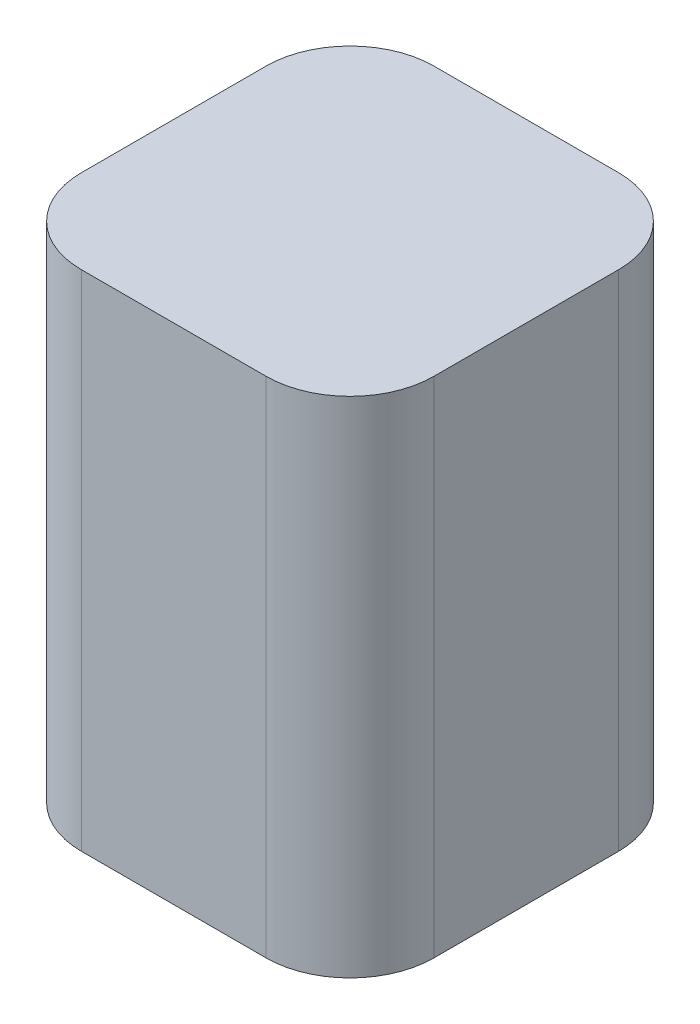
ISO-10303-21;
HEADER;
FILE_DESCRIPTION(('STEP AP214'),'2;1');
FILE_NAME('part.step','',(''),(''),'','','');
FILE_SCHEMA(('AUTOMOTIVE_DESIGN { 1 0 10303 214 1 1 1 1 }'));
ENDSEC;
DATA;
#1=APPLICATION_CONTEXT('core data for automotive mechanical design processes');
#2=APPLICATION_PROTOCOL_DEFINITION('international standard','automotive_design',2000,#1);
#3=PRODUCT_CONTEXT('',#1,'mechanical');
#4=PRODUCT('Part','Part','',(#3));
#5=PRODUCT_RELATED_PRODUCT_CATEGORY('part','',(#4));
#6=PRODUCT_DEFINITION_FORMATION('','',#4);
#7=PRODUCT_DEFINITION_CONTEXT('part definition',#1,'design');
#8=PRODUCT_DEFINITION('design','',#6,#7);
#9=PRODUCT_DEFINITION_SHAPE('','',#8);
#10=(LENGTH_UNIT() NAMED_UNIT(*) SI_UNIT(.MILLI.,.METRE.));
#11=(NAMED_UNIT(*) PLANE_ANGLE_UNIT() SI_UNIT($,.RADIAN.));
#12=(NAMED_UNIT(*) SI_UNIT($,.STERADIAN.) SOLID_ANGLE_UNIT());
#13=UNCERTAINTY_MEASURE_WITH_UNIT(LENGTH_MEASURE(1.E-05),#10,'distance_accuracy_value','');
#14=(GEOMETRIC_REPRESENTATION_CONTEXT(3) GLOBAL_UNCERTAINTY_ASSIGNED_CONTEXT((#13)) GLOBAL_UNIT_ASSIGNED_CONTEXT((#10,
#11,#12)) REPRESENTATION_CONTEXT('',''));
#15=CARTESIAN_POINT('',(0.,0.,0.));
#16=DIRECTION('',(0.,0.,1.));
#17=DIRECTION('',(1.,0.,0.));
#18=AXIS2_PLACEMENT_3D('',#15,#16,#17);
#19=CARTESIAN_POINT('',(21.,60.,-21.));
#20=DIRECTION('',(-1.,0.,0.));
#21=DIRECTION('',(0.,0.,1.));
#22=AXIS2_PLACEMENT_3D('',#19,#20,#21);
#23=PLANE('',#22);
#24=DIRECTION('',(0.,0.,-1.));
#25=VECTOR('',#24,1.);
#26=CARTESIAN_POINT('',(21.,0.,-21.));
#27=LINE('',#26,#25);
#28=CARTESIAN_POINT('',(21.,0.,11.));
#29=VERTEX_POINT('',#28);
#30=CARTESIAN_POINT('',(21.,0.,-11.));
#31=VERTEX_POINT('',#30);
#32=EDGE_CURVE('E129',#29,#31,#27,.T.);
#33=ORIENTED_EDGE('',*,*,#32,.T.);
#34=DIRECTION('',(0.,-1.,0.));
#35=VECTOR('',#34,1.);
#36=CARTESIAN_POINT('',(21.,60.,-11.));
#37=LINE('',#36,#35);
#38=CARTESIAN_POINT('',(21.,60.,-11.));
#39=VERTEX_POINT('',#38);
#40=EDGE_CURVE('E11',#31,#39,#37,.F.);
#41=ORIENTED_EDGE('',*,*,#40,.T.);
#42=DIRECTION('',(0.,0.,-1.));
#43=VECTOR('',#42,1.);
#44=CARTESIAN_POINT('',(21.,60.,-21.));
#45=LINE('',#44,#43);
#46=CARTESIAN_POINT('',(21.,60.,11.));
#47=VERTEX_POINT('',#46);
#48=EDGE_CURVE('E127',#47,#39,#45,.T.);
#49=ORIENTED_EDGE('',*,*,#48,.F.);
#50=DIRECTION('',(0.,-1.,0.));
#51=VECTOR('',#50,1.);
#52=CARTESIAN_POINT('',(21.,60.,11.));
#53=LINE('',#52,#51);
#54=EDGE_CURVE('E41',#47,#29,#53,.T.);
#55=ORIENTED_EDGE('',*,*,#54,.T.);
#56=EDGE_LOOP('',(#33,#41,#49,#55));
#57=FACE_BOUND('',#56,.T.);
#58=ADVANCED_FACE('F33',(#57),#23,.F.);
#59=CARTESIAN_POINT('',(-21.,60.,-21.));
#60=DIRECTION('',(0.,0.,1.));
#61=DIRECTION('',(1.,0.,0.));
#62=AXIS2_PLACEMENT_3D('',#59,#60,#61);
#63=PLANE('',#62);
#64=DIRECTION('',(-1.,0.,0.));
#65=VECTOR('',#64,1.);
#66=CARTESIAN_POINT('',(-21.,0.,-21.));
#67=LINE('',#66,#65);
#68=CARTESIAN_POINT('',(11.,0.,-21.));
#69=VERTEX_POINT('',#68);
#70=CARTESIAN_POINT('',(-11.,0.,-21.));
#71=VERTEX_POINT('',#70);
#72=EDGE_CURVE('E125',#69,#71,#67,.T.);
#73=ORIENTED_EDGE('',*,*,#72,.T.);
#74=DIRECTION('',(0.,-1.,0.));
#75=VECTOR('',#74,1.);
#76=CARTESIAN_POINT('',(-11.,60.,-21.));
#77=LINE('',#76,#75);
#78=CARTESIAN_POINT('',(-11.,60.,-21.));
#79=VERTEX_POINT('',#78);
#80=EDGE_CURVE('E104',#71,#79,#77,.F.);
#81=ORIENTED_EDGE('',*,*,#80,.T.);
#82=DIRECTION('',(-1.,0.,0.));
#83=VECTOR('',#82,1.);
#84=CARTESIAN_POINT('',(-21.,60.,-21.));
#85=LINE('',#84,#83);
#86=CARTESIAN_POINT('',(11.,60.,-21.));
#87=VERTEX_POINT('',#86);
#88=EDGE_CURVE('E165',#87,#79,#85,.T.);
#89=ORIENTED_EDGE('',*,*,#88,.F.);
#90=DIRECTION('',(0.,-1.,0.));
#91=VECTOR('',#90,1.);
#92=CARTESIAN_POINT('',(11.,60.,-21.));
#93=LINE('',#92,#91);
#94=EDGE_CURVE('E109',#87,#69,#93,.T.);
#95=ORIENTED_EDGE('',*,*,#94,.T.);
#96=EDGE_LOOP('',(#73,#81,#89,#95));
#97=FACE_BOUND('',#96,.T.);
#98=ADVANCED_FACE('F175',(#97),#63,.F.);
#99=CARTESIAN_POINT('',(-21.,60.,-21.));
#100=DIRECTION('',(1.,0.,0.));
#101=DIRECTION('',(0.,0.,-1.));
#102=AXIS2_PLACEMENT_3D('',#99,#100,#101);
#103=PLANE('',#102);
#104=DIRECTION('',(0.,0.,1.));
#105=VECTOR('',#104,1.);
#106=CARTESIAN_POINT('',(-21.,60.,-21.));
#107=LINE('',#106,#105);
#108=CARTESIAN_POINT('',(-21.,60.,-11.));
#109=VERTEX_POINT('',#108);
#110=CARTESIAN_POINT('',(-21.,60.,11.));
#111=VERTEX_POINT('',#110);
#112=EDGE_CURVE('E118',#109,#111,#107,.T.);
#113=ORIENTED_EDGE('',*,*,#112,.F.);
#114=DIRECTION('',(0.,-1.,0.));
#115=VECTOR('',#114,1.);
#116=CARTESIAN_POINT('',(-21.,60.,-11.));
#117=LINE('',#116,#115);
#118=CARTESIAN_POINT('',(-21.,0.,-11.));
#119=VERTEX_POINT('',#118);
#120=EDGE_CURVE('E103',#109,#119,#117,.T.);
#121=ORIENTED_EDGE('',*,*,#120,.T.);
#122=DIRECTION('',(0.,0.,1.));
#123=VECTOR('',#122,1.);
#124=CARTESIAN_POINT('',(-21.,0.,-21.));
#125=LINE('',#124,#123);
#126=CARTESIAN_POINT('',(-21.,0.,11.));
#127=VERTEX_POINT('',#126);
#128=EDGE_CURVE('E116',#119,#127,#125,.T.);
#129=ORIENTED_EDGE('',*,*,#128,.T.);
#130=DIRECTION('',(0.,-1.,0.));
#131=VECTOR('',#130,1.);
#132=CARTESIAN_POINT('',(-21.,60.,11.));
#133=LINE('',#132,#131);
#134=EDGE_CURVE('E120',#127,#111,#133,.F.);
#135=ORIENTED_EDGE('',*,*,#134,.T.);
#136=EDGE_LOOP('',(#113,#121,#129,#135));
#137=FACE_BOUND('',#136,.T.);
#138=ADVANCED_FACE('F115',(#137),#103,.F.);
#139=CARTESIAN_POINT('',(-21.,60.,21.));
#140=DIRECTION('',(0.,0.,-1.));
#141=DIRECTION('',(-1.,0.,0.));
#142=AXIS2_PLACEMENT_3D('',#139,#140,#141);
#143=PLANE('',#142);
#144=DIRECTION('',(1.,0.,0.));
#145=VECTOR('',#144,1.);
#146=CARTESIAN_POINT('',(-21.,60.,21.));
#147=LINE('',#146,#145);
#148=CARTESIAN_POINT('',(-11.,60.,21.));
#149=VERTEX_POINT('',#148);
#150=CARTESIAN_POINT('',(11.,60.,21.));
#151=VERTEX_POINT('',#150);
#152=EDGE_CURVE('E133',#149,#151,#147,.T.);
#153=ORIENTED_EDGE('',*,*,#152,.F.);
#154=DIRECTION('',(0.,-1.,0.));
#155=VECTOR('',#154,1.);
#156=CARTESIAN_POINT('',(-11.,60.,21.));
#157=LINE('',#156,#155);
#158=CARTESIAN_POINT('',(-11.,0.,21.));
#159=VERTEX_POINT('',#158);
#160=EDGE_CURVE('E150',#149,#159,#157,.T.);
#161=ORIENTED_EDGE('',*,*,#160,.T.);
#162=DIRECTION('',(1.,0.,0.));
#163=VECTOR('',#162,1.);
#164=CARTESIAN_POINT('',(-21.,0.,21.));
#165=LINE('',#164,#163);
#166=CARTESIAN_POINT('',(11.,0.,21.));
#167=VERTEX_POINT('',#166);
#168=EDGE_CURVE('E124',#159,#167,#165,.T.);
#169=ORIENTED_EDGE('',*,*,#168,.T.);
#170=DIRECTION('',(0.,-1.,0.));
#171=VECTOR('',#170,1.);
#172=CARTESIAN_POINT('',(11.,60.,21.));
#173=LINE('',#172,#171);
#174=EDGE_CURVE('E48',#167,#151,#173,.F.);
#175=ORIENTED_EDGE('',*,*,#174,.T.);
#176=EDGE_LOOP('',(#153,#161,#169,#175));
#177=FACE_BOUND('',#176,.T.);
#178=ADVANCED_FACE('F179',(#177),#143,.F.);
#179=CARTESIAN_POINT('',(0.,60.,0.));
#180=DIRECTION('',(0.,1.,0.));
#181=DIRECTION('',(0.,0.,1.));
#182=AXIS2_PLACEMENT_3D('',#179,#180,#181);
#183=PLANE('',#182);
#184=ORIENTED_EDGE('',*,*,#88,.T.);
#185=CARTESIAN_POINT('',(-11.,60.,-11.));
#186=DIRECTION('',(0.,1.,0.));
#187=DIRECTION('',(0.,0.,1.));
#188=AXIS2_PLACEMENT_3D('',#185,#186,#187);
#189=CIRCLE('',#188,10.);
#190=EDGE_CURVE('E147',#79,#109,#189,.T.);
#191=ORIENTED_EDGE('',*,*,#190,.T.);
#192=ORIENTED_EDGE('',*,*,#112,.T.);
#193=CARTESIAN_POINT('',(-11.,60.,11.));
#194=DIRECTION('',(0.,1.,0.));
#195=DIRECTION('',(0.,0.,1.));
#196=AXIS2_PLACEMENT_3D('',#193,#194,#195);
#197=CIRCLE('',#196,10.);
#198=EDGE_CURVE('E55',#111,#149,#197,.T.);
#199=ORIENTED_EDGE('',*,*,#198,.T.);
#200=ORIENTED_EDGE('',*,*,#152,.T.);
#201=CARTESIAN_POINT('',(11.,60.,11.));
#202=DIRECTION('',(0.,1.,0.));
#203=DIRECTION('',(0.,0.,1.));
#204=AXIS2_PLACEMENT_3D('',#201,#202,#203);
#205=CIRCLE('',#204,10.);
#206=EDGE_CURVE('E142',#151,#47,#205,.T.);
#207=ORIENTED_EDGE('',*,*,#206,.T.);
#208=ORIENTED_EDGE('',*,*,#48,.T.);
#209=CARTESIAN_POINT('',(11.,60.,-11.));
#210=DIRECTION('',(0.,1.,0.));
#211=DIRECTION('',(0.,0.,1.));
#212=AXIS2_PLACEMENT_3D('',#209,#210,#211);
#213=CIRCLE('',#212,10.);
#214=EDGE_CURVE('E144',#39,#87,#213,.T.);
#215=ORIENTED_EDGE('',*,*,#214,.T.);
#216=EDGE_LOOP('',(#184,#191,#192,#199,#200,#207,#208,#215));
#217=FACE_BOUND('',#216,.T.);
#218=ADVANCED_FACE('F169',(#217),#183,.T.);
#219=CARTESIAN_POINT('',(0.,0.,0.));
#220=DIRECTION('',(0.,1.,0.));
#221=DIRECTION('',(0.,0.,1.));
#222=AXIS2_PLACEMENT_3D('',#219,#220,#221);
#223=PLANE('',#222);
#224=ORIENTED_EDGE('',*,*,#128,.F.);
#225=CARTESIAN_POINT('',(-11.,0.,-11.));
#226=DIRECTION('',(0.,1.,0.));
#227=DIRECTION('',(0.,0.,1.));
#228=AXIS2_PLACEMENT_3D('',#225,#226,#227);
#229=CIRCLE('',#228,10.);
#230=EDGE_CURVE('E99',#119,#71,#229,.F.);
#231=ORIENTED_EDGE('',*,*,#230,.T.);
#232=ORIENTED_EDGE('',*,*,#72,.F.);
#233=CARTESIAN_POINT('',(11.,0.,-11.));
#234=DIRECTION('',(0.,1.,0.));
#235=DIRECTION('',(0.,0.,1.));
#236=AXIS2_PLACEMENT_3D('',#233,#234,#235);
#237=CIRCLE('',#236,10.);
#238=EDGE_CURVE('E136',#69,#31,#237,.F.);
#239=ORIENTED_EDGE('',*,*,#238,.T.);
#240=ORIENTED_EDGE('',*,*,#32,.F.);
#241=CARTESIAN_POINT('',(11.,0.,11.));
#242=DIRECTION('',(0.,1.,0.));
#243=DIRECTION('',(0.,0.,1.));
#244=AXIS2_PLACEMENT_3D('',#241,#242,#243);
#245=CIRCLE('',#244,10.);
#246=EDGE_CURVE('E119',#29,#167,#245,.F.);
#247=ORIENTED_EDGE('',*,*,#246,.T.);
#248=ORIENTED_EDGE('',*,*,#168,.F.);
#249=CARTESIAN_POINT('',(-11.,0.,11.));
#250=DIRECTION('',(0.,1.,0.));
#251=DIRECTION('',(0.,0.,1.));
#252=AXIS2_PLACEMENT_3D('',#249,#250,#251);
#253=CIRCLE('',#252,10.);
#254=EDGE_CURVE('E110',#159,#127,#253,.F.);
#255=ORIENTED_EDGE('',*,*,#254,.T.);
#256=EDGE_LOOP('',(#224,#231,#232,#239,#240,#247,#248,#255));
#257=FACE_BOUND('',#256,.T.);
#258=ADVANCED_FACE('F122',(#257),#223,.F.);
#259=CARTESIAN_POINT('',(-11.,60.,-11.));
#260=DIRECTION('',(0.,-1.,0.));
#261=DIRECTION('',(0.,0.,-1.));
#262=AXIS2_PLACEMENT_3D('',#259,#260,#261);
#263=CYLINDRICAL_SURFACE('',#262,10.);
#264=ORIENTED_EDGE('',*,*,#190,.F.);
#265=ORIENTED_EDGE('',*,*,#80,.F.);
#266=ORIENTED_EDGE('',*,*,#230,.F.);
#267=ORIENTED_EDGE('',*,*,#120,.F.);
#268=EDGE_LOOP('',(#264,#265,#266,#267));
#269=FACE_BOUND('',#268,.T.);
#270=ADVANCED_FACE('F102',(#269),#263,.T.);
#271=CARTESIAN_POINT('',(-11.,60.,11.));
#272=DIRECTION('',(0.,-1.,0.));
#273=DIRECTION('',(0.,0.,-1.));
#274=AXIS2_PLACEMENT_3D('',#271,#272,#273);
#275=CYLINDRICAL_SURFACE('',#274,10.);
#276=ORIENTED_EDGE('',*,*,#198,.F.);
#277=ORIENTED_EDGE('',*,*,#134,.F.);
#278=ORIENTED_EDGE('',*,*,#254,.F.);
#279=ORIENTED_EDGE('',*,*,#160,.F.);
#280=EDGE_LOOP('',(#276,#277,#278,#279));
#281=FACE_BOUND('',#280,.T.);
#282=ADVANCED_FACE('F178',(#281),#275,.T.);
#283=CARTESIAN_POINT('',(11.,60.,-11.));
#284=DIRECTION('',(0.,-1.,0.));
#285=DIRECTION('',(0.,0.,-1.));
#286=AXIS2_PLACEMENT_3D('',#283,#284,#285);
#287=CYLINDRICAL_SURFACE('',#286,10.);
#288=ORIENTED_EDGE('',*,*,#214,.F.);
#289=ORIENTED_EDGE('',*,*,#40,.F.);
#290=ORIENTED_EDGE('',*,*,#238,.F.);
#291=ORIENTED_EDGE('',*,*,#94,.F.);
#292=EDGE_LOOP('',(#288,#289,#290,#291));
#293=FACE_BOUND('',#292,.T.);
#294=ADVANCED_FACE('F173',(#293),#287,.T.);
#295=CARTESIAN_POINT('',(11.,60.,11.));
#296=DIRECTION('',(0.,-1.,0.));
#297=DIRECTION('',(0.,0.,-1.));
#298=AXIS2_PLACEMENT_3D('',#295,#296,#297);
#299=CYLINDRICAL_SURFACE('',#298,10.);
#300=ORIENTED_EDGE('',*,*,#206,.F.);
#301=ORIENTED_EDGE('',*,*,#174,.F.);
#302=ORIENTED_EDGE('',*,*,#246,.F.);
#303=ORIENTED_EDGE('',*,*,#54,.F.);
#304=EDGE_LOOP('',(#300,#301,#302,#303));
#305=FACE_BOUND('',#304,.T.);
#306=ADVANCED_FACE('F35',(#305),#299,.T.);
#307=CLOSED_SHELL('',(#58,#98,#138,#178,#218,#258,#270,#282,#294,#306));
#308=MANIFOLD_SOLID_BREP('B2',#307);
#309=ADVANCED_BREP_SHAPE_REPRESENTATION('',(#18,#308),#14);
#310=SHAPE_DEFINITION_REPRESENTATION(#9,#309);
ENDSEC;
END-ISO-10303-21;
